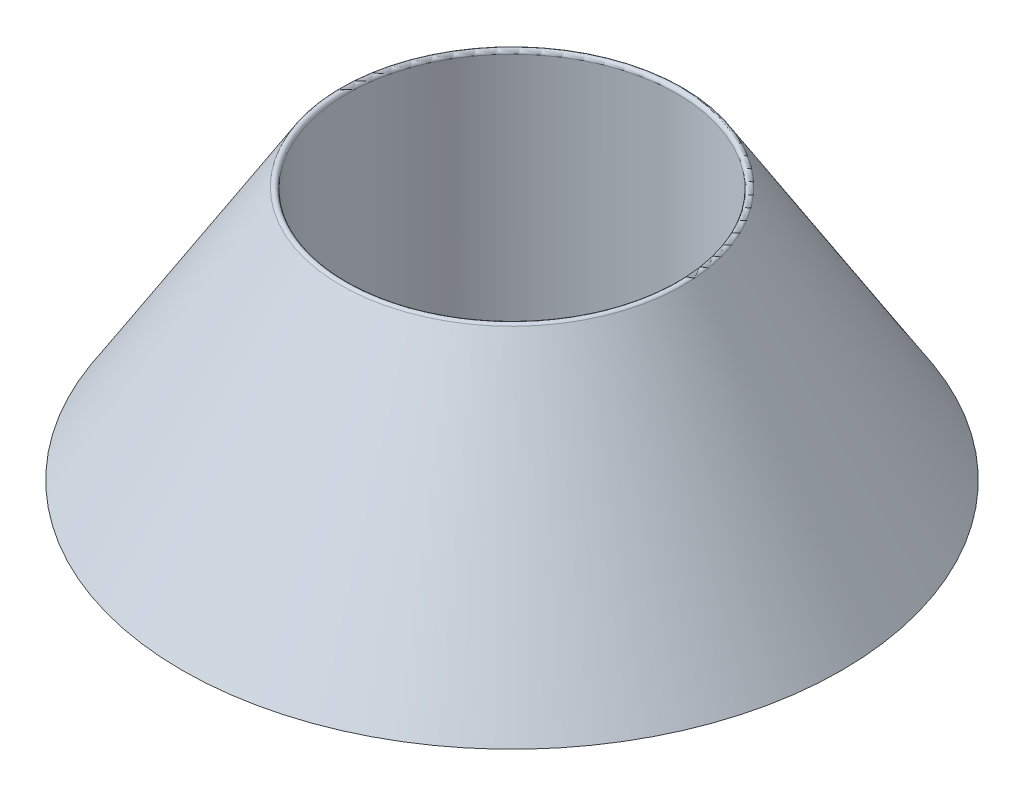
ISO-10303-21;
HEADER;
FILE_DESCRIPTION(('STEP AP214'),'2;1');
FILE_NAME('part.step','',(''),(''),'','','');
FILE_SCHEMA(('AUTOMOTIVE_DESIGN { 1 0 10303 214 1 1 1 1 }'));
ENDSEC;
DATA;
#1=APPLICATION_CONTEXT('core data for automotive mechanical design processes');
#2=APPLICATION_PROTOCOL_DEFINITION('international standard','automotive_design',2000,#1);
#3=PRODUCT_CONTEXT('',#1,'mechanical');
#4=PRODUCT('Part','Part','',(#3));
#5=PRODUCT_RELATED_PRODUCT_CATEGORY('part','',(#4));
#6=PRODUCT_DEFINITION_FORMATION('','',#4);
#7=PRODUCT_DEFINITION_CONTEXT('part definition',#1,'design');
#8=PRODUCT_DEFINITION('design','',#6,#7);
#9=PRODUCT_DEFINITION_SHAPE('','',#8);
#10=(LENGTH_UNIT() NAMED_UNIT(*) SI_UNIT(.MILLI.,.METRE.));
#11=(NAMED_UNIT(*) PLANE_ANGLE_UNIT() SI_UNIT($,.RADIAN.));
#12=(NAMED_UNIT(*) SI_UNIT($,.STERADIAN.) SOLID_ANGLE_UNIT());
#13=UNCERTAINTY_MEASURE_WITH_UNIT(LENGTH_MEASURE(1.E-05),#10,'distance_accuracy_value','');
#14=(GEOMETRIC_REPRESENTATION_CONTEXT(3) GLOBAL_UNCERTAINTY_ASSIGNED_CONTEXT((#13)) GLOBAL_UNIT_ASSIGNED_CONTEXT((#10,
#11,#12)) REPRESENTATION_CONTEXT('',''));
#15=CARTESIAN_POINT('',(0.,0.,0.));
#16=DIRECTION('',(0.,0.,1.));
#17=DIRECTION('',(1.,0.,0.));
#18=AXIS2_PLACEMENT_3D('',#15,#16,#17);
#19=CARTESIAN_POINT('',(0.,4.,0.));
#20=DIRECTION('',(0.,-1.,0.));
#21=DIRECTION('',(0.,0.,-1.));
#22=AXIS2_PLACEMENT_3D('',#19,#20,#21);
#23=CONICAL_SURFACE('',#22,2.5,0.558599315343562);
#24=CARTESIAN_POINT('',(0.,3.85216013567968,0.));
#25=DIRECTION('',(0.,-1.,0.));
#26=DIRECTION('',(0.,0.,-1.));
#27=AXIS2_PLACEMENT_3D('',#24,#25,#26);
#28=CIRCLE('',#27,2.59239991520025);
#29=CARTESIAN_POINT('',(0.,3.85216013567968,-2.59239991520025));
#30=VERTEX_POINT('',#29);
#31=EDGE_CURVE('E45',#30,#30,#28,.T.);
#32=ORIENTED_EDGE('',*,*,#31,.T.);
#33=EDGE_LOOP('',(#32));
#34=FACE_BOUND('',#33,.T.);
#35=CARTESIAN_POINT('',(0.,0.,0.));
#36=DIRECTION('',(0.,-1.,0.));
#37=DIRECTION('',(0.,0.,-1.));
#38=AXIS2_PLACEMENT_3D('',#35,#36,#37);
#39=CIRCLE('',#38,5.);
#40=CARTESIAN_POINT('',(0.,0.,-5.));
#41=VERTEX_POINT('',#40);
#42=EDGE_CURVE('E53',#41,#41,#39,.T.);
#43=ORIENTED_EDGE('',*,*,#42,.F.);
#44=EDGE_LOOP('',(#43));
#45=FACE_BOUND('',#44,.T.);
#46=ADVANCED_FACE('F38',(#34,#45),#23,.T.);
#47=CARTESIAN_POINT('',(0.,0.,0.));
#48=DIRECTION('',(0.,-1.,0.));
#49=DIRECTION('',(0.,0.,-1.));
#50=AXIS2_PLACEMENT_3D('',#47,#48,#49);
#51=CYLINDRICAL_SURFACE('',#50,2.5);
#52=CARTESIAN_POINT('',(0.,3.82566018867947,0.));
#53=DIRECTION('',(0.,1.,0.));
#54=DIRECTION('',(0.,0.,1.));
#55=AXIS2_PLACEMENT_3D('',#52,#53,#54);
#56=CIRCLE('',#55,2.5);
#57=CARTESIAN_POINT('',(0.,3.82566018867947,2.5));
#58=VERTEX_POINT('',#57);
#59=EDGE_CURVE('E10',#58,#58,#56,.T.);
#60=ORIENTED_EDGE('',*,*,#59,.T.);
#61=EDGE_LOOP('',(#60));
#62=FACE_BOUND('',#61,.T.);
#63=CARTESIAN_POINT('',(0.,0.,0.));
#64=DIRECTION('',(0.,-1.,0.));
#65=DIRECTION('',(0.,0.,-1.));
#66=AXIS2_PLACEMENT_3D('',#63,#64,#65);
#67=CIRCLE('',#66,2.5);
#68=CARTESIAN_POINT('',(0.,0.,-2.5));
#69=VERTEX_POINT('',#68);
#70=EDGE_CURVE('E49',#69,#69,#67,.T.);
#71=ORIENTED_EDGE('',*,*,#70,.T.);
#72=EDGE_LOOP('',(#71));
#73=FACE_BOUND('',#72,.T.);
#74=ADVANCED_FACE('F63',(#62,#73),#51,.F.);
#75=CARTESIAN_POINT('',(0.,0.,0.));
#76=DIRECTION('',(0.,-1.,0.));
#77=DIRECTION('',(0.,0.,-1.));
#78=AXIS2_PLACEMENT_3D('',#75,#76,#77);
#79=PLANE('',#78);
#80=ORIENTED_EDGE('',*,*,#42,.T.);
#81=EDGE_LOOP('',(#80));
#82=FACE_BOUND('',#81,.T.);
#83=ORIENTED_EDGE('',*,*,#70,.F.);
#84=EDGE_LOOP('',(#83));
#85=FACE_BOUND('',#84,.T.);
#86=ADVANCED_FACE('F59',(#82,#85),#79,.T.);
#87=CARTESIAN_POINT('',(0.,3.82566018867947,0.));
#88=DIRECTION('',(0.,1.,0.));
#89=DIRECTION('',(0.,0.,1.));
#90=AXIS2_PLACEMENT_3D('',#87,#88,#89);
#91=TOROIDAL_SURFACE('',#90,2.55,0.05);
#92=ORIENTED_EDGE('',*,*,#59,.F.);
#93=EDGE_LOOP('',(#92));
#94=FACE_BOUND('',#93,.T.);
#95=ORIENTED_EDGE('',*,*,#31,.F.);
#96=EDGE_LOOP('',(#95));
#97=FACE_BOUND('',#96,.T.);
#98=ADVANCED_FACE('F40',(#94,#97),#91,.T.);
#99=CLOSED_SHELL('',(#46,#74,#86,#98));
#100=MANIFOLD_SOLID_BREP('B2',#99);
#101=ADVANCED_BREP_SHAPE_REPRESENTATION('',(#18,#100),#14);
#102=SHAPE_DEFINITION_REPRESENTATION(#9,#101);
ENDSEC;
END-ISO-10303-21;
